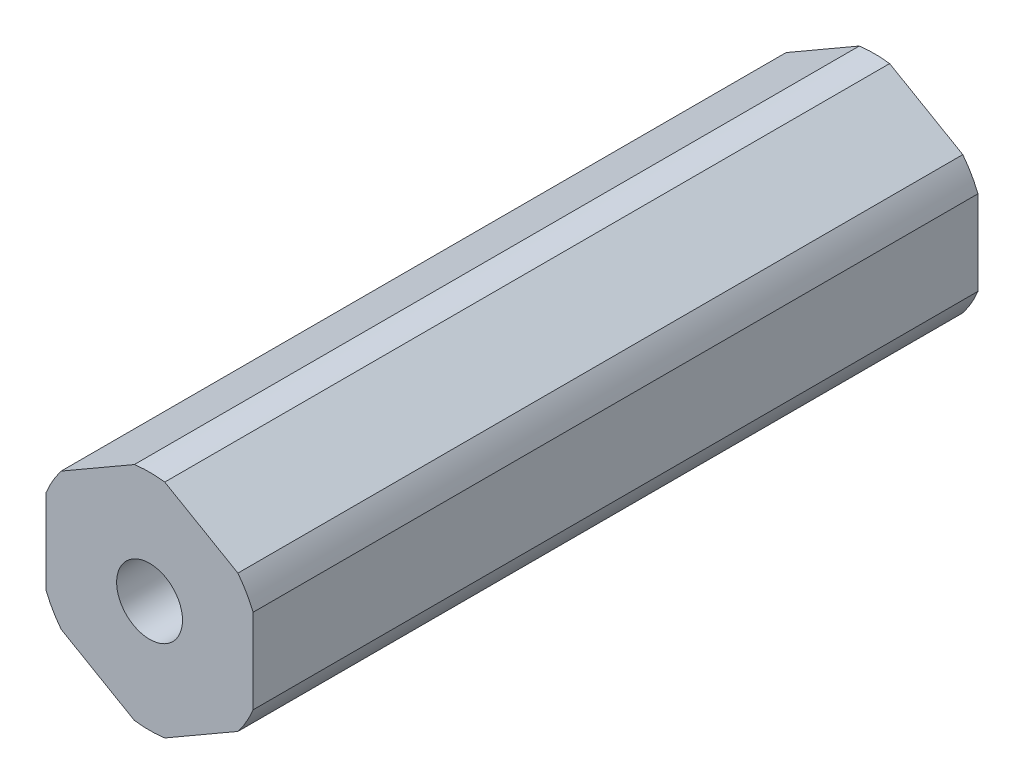
ISO-10303-21;
HEADER;
FILE_DESCRIPTION(('STEP AP214'),'2;1');
FILE_NAME('part.step','',(''),(''),'','','');
FILE_SCHEMA(('AUTOMOTIVE_DESIGN { 1 0 10303 214 1 1 1 1 }'));
ENDSEC;
DATA;
#1=APPLICATION_CONTEXT('core data for automotive mechanical design processes');
#2=APPLICATION_PROTOCOL_DEFINITION('international standard','automotive_design',2000,#1);
#3=PRODUCT_CONTEXT('',#1,'mechanical');
#4=PRODUCT('Part','Part','',(#3));
#5=PRODUCT_RELATED_PRODUCT_CATEGORY('part','',(#4));
#6=PRODUCT_DEFINITION_FORMATION('','',#4);
#7=PRODUCT_DEFINITION_CONTEXT('part definition',#1,'design');
#8=PRODUCT_DEFINITION('design','',#6,#7);
#9=PRODUCT_DEFINITION_SHAPE('','',#8);
#10=(LENGTH_UNIT() NAMED_UNIT(*) SI_UNIT(.MILLI.,.METRE.));
#11=(NAMED_UNIT(*) PLANE_ANGLE_UNIT() SI_UNIT($,.RADIAN.));
#12=(NAMED_UNIT(*) SI_UNIT($,.STERADIAN.) SOLID_ANGLE_UNIT());
#13=UNCERTAINTY_MEASURE_WITH_UNIT(LENGTH_MEASURE(1.E-05),#10,'distance_accuracy_value','');
#14=(GEOMETRIC_REPRESENTATION_CONTEXT(3) GLOBAL_UNCERTAINTY_ASSIGNED_CONTEXT((#13)) GLOBAL_UNIT_ASSIGNED_CONTEXT((#10,
#11,#12)) REPRESENTATION_CONTEXT('',''));
#15=CARTESIAN_POINT('',(0.,0.,0.));
#16=DIRECTION('',(0.,0.,1.));
#17=DIRECTION('',(1.,0.,0.));
#18=AXIS2_PLACEMENT_3D('',#15,#16,#17);
#19=CARTESIAN_POINT('',(6.34999999999999,0.,22.225));
#20=DIRECTION('',(-1.,0.,0.));
#21=DIRECTION('',(0.,-1.,0.));
#22=AXIS2_PLACEMENT_3D('',#19,#20,#21);
#23=PLANE('',#22);
#24=DIRECTION('',(0.,1.,0.));
#25=VECTOR('',#24,1.);
#26=CARTESIAN_POINT('',(6.34999999999999,0.,-22.225));
#27=LINE('',#26,#25);
#28=CARTESIAN_POINT('',(6.35000000000002,-2.59030191290509,-22.225));
#29=VERTEX_POINT('',#28);
#30=CARTESIAN_POINT('',(6.34999999999997,2.59030191290522,-22.225));
#31=VERTEX_POINT('',#30);
#32=EDGE_CURVE('E187',#29,#31,#27,.T.);
#33=ORIENTED_EDGE('',*,*,#32,.T.);
#34=DIRECTION('',(0.,0.,-1.));
#35=VECTOR('',#34,1.);
#36=CARTESIAN_POINT('',(6.34999999999997,2.59030191290522,22.225));
#37=LINE('',#36,#35);
#38=CARTESIAN_POINT('',(6.34999999999997,2.59030191290522,22.225));
#39=VERTEX_POINT('',#38);
#40=EDGE_CURVE('E11',#39,#31,#37,.T.);
#41=ORIENTED_EDGE('',*,*,#40,.F.);
#42=DIRECTION('',(0.,1.,0.));
#43=VECTOR('',#42,1.);
#44=CARTESIAN_POINT('',(6.34999999999999,0.,22.225));
#45=LINE('',#44,#43);
#46=CARTESIAN_POINT('',(6.35000000000002,-2.59030191290509,22.225));
#47=VERTEX_POINT('',#46);
#48=EDGE_CURVE('E267',#47,#39,#45,.T.);
#49=ORIENTED_EDGE('',*,*,#48,.F.);
#50=DIRECTION('',(0.,0.,-1.));
#51=VECTOR('',#50,1.);
#52=CARTESIAN_POINT('',(6.35000000000002,-2.59030191290509,22.225));
#53=LINE('',#52,#51);
#54=EDGE_CURVE('E183',#47,#29,#53,.T.);
#55=ORIENTED_EDGE('',*,*,#54,.T.);
#56=EDGE_LOOP('',(#33,#41,#49,#55));
#57=FACE_BOUND('',#56,.T.);
#58=ADVANCED_FACE('F58',(#57),#23,.F.);
#59=CARTESIAN_POINT('',(0.,0.,22.225));
#60=DIRECTION('',(0.,0.,-1.));
#61=DIRECTION('',(-1.,0.,0.));
#62=AXIS2_PLACEMENT_3D('',#59,#60,#61);
#63=CYLINDRICAL_SURFACE('',#62,6.858);
#64=CARTESIAN_POINT('',(0.,0.,-22.225));
#65=DIRECTION('',(0.,0.,1.));
#66=DIRECTION('',(1.,0.,0.));
#67=AXIS2_PLACEMENT_3D('',#64,#65,#66);
#68=CIRCLE('',#67,6.858);
#69=CARTESIAN_POINT('',(5.41826726004722,4.20411035757868,-22.225));
#70=VERTEX_POINT('',#69);
#71=EDGE_CURVE('E191',#31,#70,#68,.T.);
#72=ORIENTED_EDGE('',*,*,#71,.T.);
#73=DIRECTION('',(0.,0.,-1.));
#74=VECTOR('',#73,1.);
#75=CARTESIAN_POINT('',(5.41826726004722,4.20411035757868,22.225));
#76=LINE('',#75,#74);
#77=CARTESIAN_POINT('',(5.41826726004722,4.20411035757868,22.225));
#78=VERTEX_POINT('',#77);
#79=EDGE_CURVE('E67',#78,#70,#76,.T.);
#80=ORIENTED_EDGE('',*,*,#79,.F.);
#81=CARTESIAN_POINT('',(0.,0.,22.225));
#82=DIRECTION('',(0.,0.,1.));
#83=DIRECTION('',(1.,0.,0.));
#84=AXIS2_PLACEMENT_3D('',#81,#82,#83);
#85=CIRCLE('',#84,6.858);
#86=EDGE_CURVE('E131',#39,#78,#85,.T.);
#87=ORIENTED_EDGE('',*,*,#86,.F.);
#88=ORIENTED_EDGE('',*,*,#40,.T.);
#89=EDGE_LOOP('',(#72,#80,#87,#88));
#90=FACE_BOUND('',#89,.T.);
#91=ADVANCED_FACE('F310',(#90),#63,.T.);
#92=CARTESIAN_POINT('',(3.17499999999998,5.49926131403122,22.225));
#93=DIRECTION('',(-0.499999999999995,-0.866025403784441,0.));
#94=DIRECTION('',(0.866025403784441,-0.499999999999995,0.));
#95=AXIS2_PLACEMENT_3D('',#92,#93,#94);
#96=PLANE('',#95);
#97=DIRECTION('',(-0.866025403784441,0.499999999999995,0.));
#98=VECTOR('',#97,1.);
#99=CARTESIAN_POINT('',(3.17499999999998,5.49926131403122,-22.225));
#100=LINE('',#99,#98);
#101=CARTESIAN_POINT('',(0.931732739952733,6.79441227048375,-22.225));
#102=VERTEX_POINT('',#101);
#103=EDGE_CURVE('E195',#70,#102,#100,.T.);
#104=ORIENTED_EDGE('',*,*,#103,.T.);
#105=DIRECTION('',(0.,0.,-1.));
#106=VECTOR('',#105,1.);
#107=CARTESIAN_POINT('',(0.931732739952733,6.79441227048375,22.225));
#108=LINE('',#107,#106);
#109=CARTESIAN_POINT('',(0.931732739952733,6.79441227048375,22.225));
#110=VERTEX_POINT('',#109);
#111=EDGE_CURVE('E238',#110,#102,#108,.T.);
#112=ORIENTED_EDGE('',*,*,#111,.F.);
#113=DIRECTION('',(-0.866025403784441,0.499999999999995,0.));
#114=VECTOR('',#113,1.);
#115=CARTESIAN_POINT('',(3.17499999999998,5.49926131403122,22.225));
#116=LINE('',#115,#114);
#117=EDGE_CURVE('E248',#78,#110,#116,.T.);
#118=ORIENTED_EDGE('',*,*,#117,.F.);
#119=ORIENTED_EDGE('',*,*,#79,.T.);
#120=EDGE_LOOP('',(#104,#112,#118,#119));
#121=FACE_BOUND('',#120,.T.);
#122=ADVANCED_FACE('F246',(#121),#96,.F.);
#123=CARTESIAN_POINT('',(-0.931732739952723,6.79441227048375,-22.225));
#124=VERTEX_POINT('',#123);
#125=EDGE_CURVE('E196',#102,#124,#68,.T.);
#126=ORIENTED_EDGE('',*,*,#125,.T.);
#127=DIRECTION('',(0.,0.,-1.));
#128=VECTOR('',#127,1.);
#129=CARTESIAN_POINT('',(-0.931732739952723,6.79441227048375,22.225));
#130=LINE('',#129,#128);
#131=CARTESIAN_POINT('',(-0.931732739952723,6.79441227048375,22.225));
#132=VERTEX_POINT('',#131);
#133=EDGE_CURVE('E234',#132,#124,#130,.T.);
#134=ORIENTED_EDGE('',*,*,#133,.F.);
#135=EDGE_CURVE('E273',#110,#132,#85,.T.);
#136=ORIENTED_EDGE('',*,*,#135,.F.);
#137=ORIENTED_EDGE('',*,*,#111,.T.);
#138=EDGE_LOOP('',(#126,#134,#136,#137));
#139=FACE_BOUND('',#138,.T.);
#140=ADVANCED_FACE('F293',(#139),#63,.T.);
#141=CARTESIAN_POINT('',(-3.175,5.49926131403118,22.225));
#142=DIRECTION('',(0.500000000000001,-0.866025403784438,0.));
#143=DIRECTION('',(0.866025403784438,0.500000000000001,0.));
#144=AXIS2_PLACEMENT_3D('',#141,#142,#143);
#145=PLANE('',#144);
#146=DIRECTION('',(-0.866025403784438,-0.500000000000001,0.));
#147=VECTOR('',#146,1.);
#148=CARTESIAN_POINT('',(-3.175,5.49926131403118,-22.225));
#149=LINE('',#148,#147);
#150=CARTESIAN_POINT('',(-5.41826726004729,4.2041103575786,-22.225));
#151=VERTEX_POINT('',#150);
#152=EDGE_CURVE('E199',#124,#151,#149,.T.);
#153=ORIENTED_EDGE('',*,*,#152,.T.);
#154=DIRECTION('',(0.,0.,-1.));
#155=VECTOR('',#154,1.);
#156=CARTESIAN_POINT('',(-5.41826726004729,4.2041103575786,22.225));
#157=LINE('',#156,#155);
#158=CARTESIAN_POINT('',(-5.41826726004729,4.2041103575786,22.225));
#159=VERTEX_POINT('',#158);
#160=EDGE_CURVE('E230',#159,#151,#157,.T.);
#161=ORIENTED_EDGE('',*,*,#160,.F.);
#162=DIRECTION('',(-0.866025403784438,-0.500000000000001,0.));
#163=VECTOR('',#162,1.);
#164=CARTESIAN_POINT('',(-3.175,5.49926131403118,22.225));
#165=LINE('',#164,#163);
#166=EDGE_CURVE('E279',#132,#159,#165,.T.);
#167=ORIENTED_EDGE('',*,*,#166,.F.);
#168=ORIENTED_EDGE('',*,*,#133,.T.);
#169=EDGE_LOOP('',(#153,#161,#167,#168));
#170=FACE_BOUND('',#169,.T.);
#171=ADVANCED_FACE('F295',(#170),#145,.F.);
#172=CARTESIAN_POINT('',(-6.35,2.59030191290513,-22.225));
#173=VERTEX_POINT('',#172);
#174=EDGE_CURVE('E202',#151,#173,#68,.T.);
#175=ORIENTED_EDGE('',*,*,#174,.T.);
#176=DIRECTION('',(0.,0.,-1.));
#177=VECTOR('',#176,1.);
#178=CARTESIAN_POINT('',(-6.35,2.59030191290513,22.225));
#179=LINE('',#178,#177);
#180=CARTESIAN_POINT('',(-6.35,2.59030191290513,22.225));
#181=VERTEX_POINT('',#180);
#182=EDGE_CURVE('E226',#181,#173,#179,.T.);
#183=ORIENTED_EDGE('',*,*,#182,.F.);
#184=EDGE_CURVE('E281',#159,#181,#85,.T.);
#185=ORIENTED_EDGE('',*,*,#184,.F.);
#186=ORIENTED_EDGE('',*,*,#160,.T.);
#187=EDGE_LOOP('',(#175,#183,#185,#186));
#188=FACE_BOUND('',#187,.T.);
#189=ADVANCED_FACE('F296',(#188),#63,.T.);
#190=CARTESIAN_POINT('',(-6.34999999999999,0.,22.225));
#191=DIRECTION('',(1.,0.,0.));
#192=DIRECTION('',(0.,1.,0.));
#193=AXIS2_PLACEMENT_3D('',#190,#191,#192);
#194=PLANE('',#193);
#195=DIRECTION('',(0.,-1.,0.));
#196=VECTOR('',#195,1.);
#197=CARTESIAN_POINT('',(-6.34999999999999,0.,-22.225));
#198=LINE('',#197,#196);
#199=CARTESIAN_POINT('',(-6.34999999999999,-2.59030191290517,-22.225));
#200=VERTEX_POINT('',#199);
#201=EDGE_CURVE('E203',#173,#200,#198,.T.);
#202=ORIENTED_EDGE('',*,*,#201,.T.);
#203=DIRECTION('',(0.,0.,-1.));
#204=VECTOR('',#203,1.);
#205=CARTESIAN_POINT('',(-6.34999999999999,-2.59030191290517,22.225));
#206=LINE('',#205,#204);
#207=CARTESIAN_POINT('',(-6.34999999999999,-2.59030191290517,22.225));
#208=VERTEX_POINT('',#207);
#209=EDGE_CURVE('E222',#208,#200,#206,.T.);
#210=ORIENTED_EDGE('',*,*,#209,.F.);
#211=DIRECTION('',(0.,-1.,0.));
#212=VECTOR('',#211,1.);
#213=CARTESIAN_POINT('',(-6.34999999999999,0.,22.225));
#214=LINE('',#213,#212);
#215=EDGE_CURVE('E282',#181,#208,#214,.T.);
#216=ORIENTED_EDGE('',*,*,#215,.F.);
#217=ORIENTED_EDGE('',*,*,#182,.T.);
#218=EDGE_LOOP('',(#202,#210,#216,#217));
#219=FACE_BOUND('',#218,.T.);
#220=ADVANCED_FACE('F299',(#219),#194,.F.);
#221=CARTESIAN_POINT('',(-5.41826726004726,-4.20411035757864,-22.225));
#222=VERTEX_POINT('',#221);
#223=EDGE_CURVE('E206',#200,#222,#68,.T.);
#224=ORIENTED_EDGE('',*,*,#223,.T.);
#225=DIRECTION('',(0.,0.,-1.));
#226=VECTOR('',#225,1.);
#227=CARTESIAN_POINT('',(-5.41826726004726,-4.20411035757864,22.225));
#228=LINE('',#227,#226);
#229=CARTESIAN_POINT('',(-5.41826726004726,-4.20411035757864,22.225));
#230=VERTEX_POINT('',#229);
#231=EDGE_CURVE('E218',#230,#222,#228,.T.);
#232=ORIENTED_EDGE('',*,*,#231,.F.);
#233=EDGE_CURVE('E170',#208,#230,#85,.T.);
#234=ORIENTED_EDGE('',*,*,#233,.F.);
#235=ORIENTED_EDGE('',*,*,#209,.T.);
#236=EDGE_LOOP('',(#224,#232,#234,#235));
#237=FACE_BOUND('',#236,.T.);
#238=ADVANCED_FACE('F301',(#237),#63,.T.);
#239=CARTESIAN_POINT('',(-3.17499999999997,-5.4992613140312,22.225));
#240=DIRECTION('',(0.499999999999995,0.866025403784441,0.));
#241=DIRECTION('',(-0.866025403784442,0.499999999999995,0.));
#242=AXIS2_PLACEMENT_3D('',#239,#240,#241);
#243=PLANE('',#242);
#244=DIRECTION('',(0.866025403784442,-0.499999999999995,0.));
#245=VECTOR('',#244,1.);
#246=CARTESIAN_POINT('',(-3.17499999999997,-5.4992613140312,-22.225));
#247=LINE('',#246,#245);
#248=CARTESIAN_POINT('',(-0.931732739952672,-6.79441227048376,-22.225));
#249=VERTEX_POINT('',#248);
#250=EDGE_CURVE('E207',#222,#249,#247,.T.);
#251=ORIENTED_EDGE('',*,*,#250,.T.);
#252=DIRECTION('',(0.,0.,-1.));
#253=VECTOR('',#252,1.);
#254=CARTESIAN_POINT('',(-0.931732739952672,-6.79441227048376,22.225));
#255=LINE('',#254,#253);
#256=CARTESIAN_POINT('',(-0.931732739952672,-6.79441227048376,22.225));
#257=VERTEX_POINT('',#256);
#258=EDGE_CURVE('E176',#257,#249,#255,.T.);
#259=ORIENTED_EDGE('',*,*,#258,.F.);
#260=DIRECTION('',(0.866025403784442,-0.499999999999995,0.));
#261=VECTOR('',#260,1.);
#262=CARTESIAN_POINT('',(-3.17499999999997,-5.4992613140312,22.225));
#263=LINE('',#262,#261);
#264=EDGE_CURVE('E164',#230,#257,#263,.T.);
#265=ORIENTED_EDGE('',*,*,#264,.F.);
#266=ORIENTED_EDGE('',*,*,#231,.T.);
#267=EDGE_LOOP('',(#251,#259,#265,#266));
#268=FACE_BOUND('',#267,.T.);
#269=ADVANCED_FACE('F304',(#268),#243,.F.);
#270=CARTESIAN_POINT('',(0.931732739952763,-6.79441227048375,-22.225));
#271=VERTEX_POINT('',#270);
#272=EDGE_CURVE('E174',#249,#271,#68,.T.);
#273=ORIENTED_EDGE('',*,*,#272,.T.);
#274=DIRECTION('',(0.,0.,-1.));
#275=VECTOR('',#274,1.);
#276=CARTESIAN_POINT('',(0.931732739952763,-6.79441227048375,22.225));
#277=LINE('',#276,#275);
#278=CARTESIAN_POINT('',(0.931732739952763,-6.79441227048375,22.225));
#279=VERTEX_POINT('',#278);
#280=EDGE_CURVE('E171',#279,#271,#277,.T.);
#281=ORIENTED_EDGE('',*,*,#280,.F.);
#282=EDGE_CURVE('E158',#257,#279,#85,.T.);
#283=ORIENTED_EDGE('',*,*,#282,.F.);
#284=ORIENTED_EDGE('',*,*,#258,.T.);
#285=EDGE_LOOP('',(#273,#281,#283,#284));
#286=FACE_BOUND('',#285,.T.);
#287=ADVANCED_FACE('F172',(#286),#63,.T.);
#288=CARTESIAN_POINT('',(3.17500000000004,-5.49926131403115,22.225));
#289=DIRECTION('',(-0.500000000000007,0.866025403784435,0.));
#290=DIRECTION('',(-0.866025403784435,-0.500000000000007,0.));
#291=AXIS2_PLACEMENT_3D('',#288,#289,#290);
#292=PLANE('',#291);
#293=DIRECTION('',(0.866025403784435,0.500000000000007,0.));
#294=VECTOR('',#293,1.);
#295=CARTESIAN_POINT('',(3.17500000000004,-5.49926131403115,-22.225));
#296=LINE('',#295,#294);
#297=CARTESIAN_POINT('',(5.41826726004732,-4.20411035757856,-22.225));
#298=VERTEX_POINT('',#297);
#299=EDGE_CURVE('E117',#271,#298,#296,.T.);
#300=ORIENTED_EDGE('',*,*,#299,.T.);
#301=DIRECTION('',(0.,0.,-1.));
#302=VECTOR('',#301,1.);
#303=CARTESIAN_POINT('',(5.41826726004732,-4.20411035757856,22.225));
#304=LINE('',#303,#302);
#305=CARTESIAN_POINT('',(5.41826726004732,-4.20411035757856,22.225));
#306=VERTEX_POINT('',#305);
#307=EDGE_CURVE('E177',#306,#298,#304,.T.);
#308=ORIENTED_EDGE('',*,*,#307,.F.);
#309=DIRECTION('',(0.866025403784435,0.500000000000007,0.));
#310=VECTOR('',#309,1.);
#311=CARTESIAN_POINT('',(3.17500000000004,-5.49926131403115,22.225));
#312=LINE('',#311,#310);
#313=EDGE_CURVE('E162',#279,#306,#312,.T.);
#314=ORIENTED_EDGE('',*,*,#313,.F.);
#315=ORIENTED_EDGE('',*,*,#280,.T.);
#316=EDGE_LOOP('',(#300,#308,#314,#315));
#317=FACE_BOUND('',#316,.T.);
#318=ADVANCED_FACE('F179',(#317),#292,.F.);
#319=EDGE_CURVE('E123',#298,#29,#68,.T.);
#320=ORIENTED_EDGE('',*,*,#319,.T.);
#321=ORIENTED_EDGE('',*,*,#54,.F.);
#322=EDGE_CURVE('E75',#306,#47,#85,.T.);
#323=ORIENTED_EDGE('',*,*,#322,.F.);
#324=ORIENTED_EDGE('',*,*,#307,.T.);
#325=EDGE_LOOP('',(#320,#321,#323,#324));
#326=FACE_BOUND('',#325,.T.);
#327=ADVANCED_FACE('F307',(#326),#63,.T.);
#328=CARTESIAN_POINT('',(0.,0.,22.225));
#329=DIRECTION('',(0.,0.,1.));
#330=DIRECTION('',(1.,0.,0.));
#331=AXIS2_PLACEMENT_3D('',#328,#329,#330);
#332=PLANE('',#331);
#333=CARTESIAN_POINT('',(0.,0.,22.225));
#334=DIRECTION('',(0.,0.,1.));
#335=DIRECTION('',(1.,0.,0.));
#336=AXIS2_PLACEMENT_3D('',#333,#334,#335);
#337=CIRCLE('',#336,2.01929999999999);
#338=CARTESIAN_POINT('',(2.01929999999999,0.,22.225));
#339=VERTEX_POINT('',#338);
#340=EDGE_CURVE('E480',#339,#339,#337,.T.);
#341=ORIENTED_EDGE('',*,*,#340,.F.);
#342=EDGE_LOOP('',(#341));
#343=FACE_BOUND('',#342,.T.);
#344=ORIENTED_EDGE('',*,*,#48,.T.);
#345=ORIENTED_EDGE('',*,*,#86,.T.);
#346=ORIENTED_EDGE('',*,*,#117,.T.);
#347=ORIENTED_EDGE('',*,*,#135,.T.);
#348=ORIENTED_EDGE('',*,*,#166,.T.);
#349=ORIENTED_EDGE('',*,*,#184,.T.);
#350=ORIENTED_EDGE('',*,*,#215,.T.);
#351=ORIENTED_EDGE('',*,*,#233,.T.);
#352=ORIENTED_EDGE('',*,*,#264,.T.);
#353=ORIENTED_EDGE('',*,*,#282,.T.);
#354=ORIENTED_EDGE('',*,*,#313,.T.);
#355=ORIENTED_EDGE('',*,*,#322,.T.);
#356=EDGE_LOOP('',(#344,#345,#346,#347,#348,#349,#350,#351,#352,#353,#354,#355));
#357=FACE_BOUND('',#356,.T.);
#358=ADVANCED_FACE('F160',(#343,#357),#332,.T.);
#359=CARTESIAN_POINT('',(0.,0.,-22.225));
#360=DIRECTION('',(0.,0.,1.));
#361=DIRECTION('',(1.,0.,0.));
#362=AXIS2_PLACEMENT_3D('',#359,#360,#361);
#363=PLANE('',#362);
#364=CARTESIAN_POINT('',(0.,0.,-22.225));
#365=DIRECTION('',(0.,0.,-1.));
#366=DIRECTION('',(-1.,0.,0.));
#367=AXIS2_PLACEMENT_3D('',#364,#365,#366);
#368=CIRCLE('',#367,2.01929999999999);
#369=CARTESIAN_POINT('',(-2.01929999999999,0.,-22.225));
#370=VERTEX_POINT('',#369);
#371=EDGE_CURVE('E476',#370,#370,#368,.T.);
#372=ORIENTED_EDGE('',*,*,#371,.F.);
#373=EDGE_LOOP('',(#372));
#374=FACE_BOUND('',#373,.T.);
#375=ORIENTED_EDGE('',*,*,#32,.F.);
#376=ORIENTED_EDGE('',*,*,#319,.F.);
#377=ORIENTED_EDGE('',*,*,#299,.F.);
#378=ORIENTED_EDGE('',*,*,#272,.F.);
#379=ORIENTED_EDGE('',*,*,#250,.F.);
#380=ORIENTED_EDGE('',*,*,#223,.F.);
#381=ORIENTED_EDGE('',*,*,#201,.F.);
#382=ORIENTED_EDGE('',*,*,#174,.F.);
#383=ORIENTED_EDGE('',*,*,#152,.F.);
#384=ORIENTED_EDGE('',*,*,#125,.F.);
#385=ORIENTED_EDGE('',*,*,#103,.F.);
#386=ORIENTED_EDGE('',*,*,#71,.F.);
#387=EDGE_LOOP('',(#375,#376,#377,#378,#379,#380,#381,#382,#383,#384,#385,#386));
#388=FACE_BOUND('',#387,.T.);
#389=ADVANCED_FACE('F252',(#374,#388),#363,.F.);
#390=CARTESIAN_POINT('',(0.,0.,10.287));
#391=DIRECTION('',(0.,0.,1.));
#392=DIRECTION('',(1.,0.,0.));
#393=AXIS2_PLACEMENT_3D('',#390,#391,#392);
#394=CONICAL_SURFACE('',#393,2.0193,1.02974425867665);
#395=CARTESIAN_POINT('',(0.,0.,9.07368215199765));
#396=VERTEX_POINT('',#395);
#397=VERTEX_LOOP('',#396);
#398=FACE_BOUND('',#397,.T.);
#399=CARTESIAN_POINT('',(0.,0.,10.287));
#400=DIRECTION('',(0.,0.,1.));
#401=DIRECTION('',(1.,0.,0.));
#402=AXIS2_PLACEMENT_3D('',#399,#400,#401);
#403=CIRCLE('',#402,2.0193);
#404=CARTESIAN_POINT('',(2.0193,0.,10.287));
#405=VERTEX_POINT('',#404);
#406=EDGE_CURVE('E192',#405,#405,#403,.T.);
#407=ORIENTED_EDGE('',*,*,#406,.T.);
#408=EDGE_LOOP('',(#407));
#409=FACE_BOUND('',#408,.T.);
#410=ADVANCED_FACE('F406',(#398,#409),#394,.F.);
#411=CARTESIAN_POINT('',(0.,0.,22.225));
#412=DIRECTION('',(0.,0.,1.));
#413=DIRECTION('',(1.,0.,0.));
#414=AXIS2_PLACEMENT_3D('',#411,#412,#413);
#415=CYLINDRICAL_SURFACE('',#414,2.01929999999999);
#416=ORIENTED_EDGE('',*,*,#406,.F.);
#417=EDGE_LOOP('',(#416));
#418=FACE_BOUND('',#417,.T.);
#419=ORIENTED_EDGE('',*,*,#340,.T.);
#420=EDGE_LOOP('',(#419));
#421=FACE_BOUND('',#420,.T.);
#422=ADVANCED_FACE('F415',(#418,#421),#415,.F.);
#423=CARTESIAN_POINT('',(0.,0.,-10.287));
#424=DIRECTION('',(0.,0.,-1.));
#425=DIRECTION('',(-1.,0.,0.));
#426=AXIS2_PLACEMENT_3D('',#423,#424,#425);
#427=CONICAL_SURFACE('',#426,2.0193,1.02974425867665);
#428=CARTESIAN_POINT('',(0.,0.,-9.07368215199765));
#429=VERTEX_POINT('',#428);
#430=VERTEX_LOOP('',#429);
#431=FACE_BOUND('',#430,.T.);
#432=CARTESIAN_POINT('',(0.,0.,-10.287));
#433=DIRECTION('',(0.,0.,-1.));
#434=DIRECTION('',(-1.,0.,0.));
#435=AXIS2_PLACEMENT_3D('',#432,#433,#434);
#436=CIRCLE('',#435,2.0193);
#437=CARTESIAN_POINT('',(-2.0193,0.,-10.287));
#438=VERTEX_POINT('',#437);
#439=EDGE_CURVE('E473',#438,#438,#436,.T.);
#440=ORIENTED_EDGE('',*,*,#439,.T.);
#441=EDGE_LOOP('',(#440));
#442=FACE_BOUND('',#441,.T.);
#443=ADVANCED_FACE('F426',(#431,#442),#427,.F.);
#444=CARTESIAN_POINT('',(0.,0.,-22.225));
#445=DIRECTION('',(0.,0.,-1.));
#446=DIRECTION('',(-1.,0.,0.));
#447=AXIS2_PLACEMENT_3D('',#444,#445,#446);
#448=CYLINDRICAL_SURFACE('',#447,2.01929999999999);
#449=ORIENTED_EDGE('',*,*,#439,.F.);
#450=EDGE_LOOP('',(#449));
#451=FACE_BOUND('',#450,.T.);
#452=ORIENTED_EDGE('',*,*,#371,.T.);
#453=EDGE_LOOP('',(#452));
#454=FACE_BOUND('',#453,.T.);
#455=ADVANCED_FACE('F437',(#451,#454),#448,.F.);
#456=CLOSED_SHELL('',(#58,#91,#122,#140,#171,#189,#220,#238,#269,#287,#318,#327,#358,#389,#410,
#422,#443,#455));
#457=MANIFOLD_SOLID_BREP('B2',#456);
#458=ADVANCED_BREP_SHAPE_REPRESENTATION('',(#18,#457),#14);
#459=SHAPE_DEFINITION_REPRESENTATION(#9,#458);
ENDSEC;
END-ISO-10303-21;
